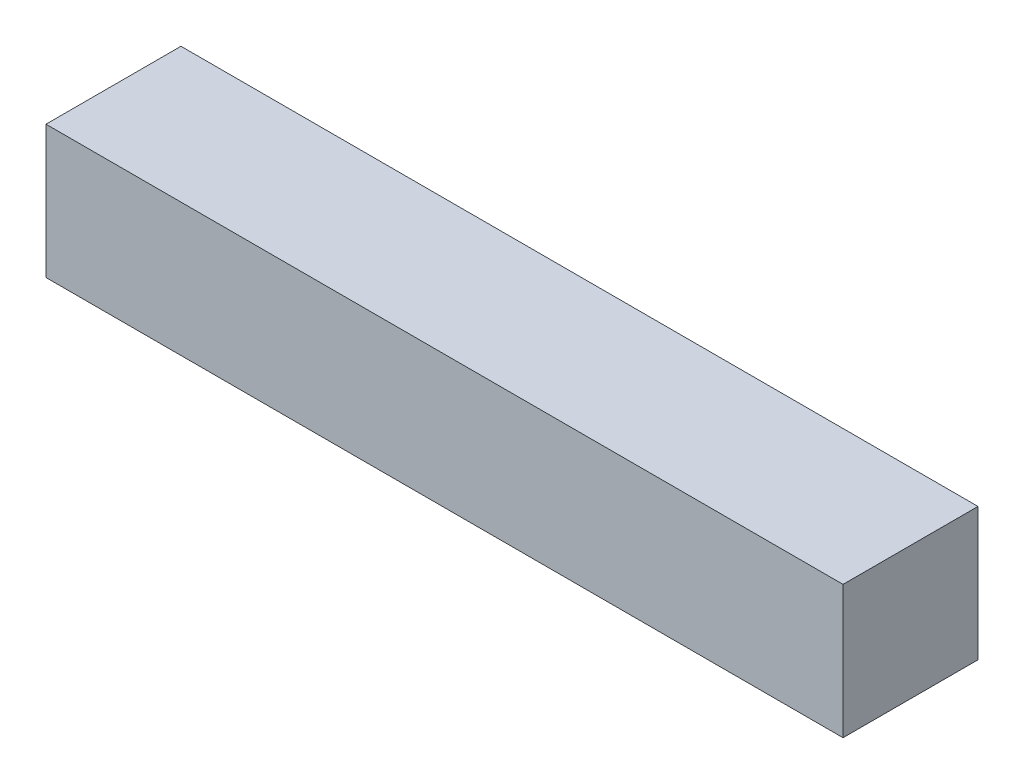
ISO-10303-21;
HEADER;
FILE_DESCRIPTION(('STEP AP214'),'2;1');
FILE_NAME('part.step','',(''),(''),'','','');
FILE_SCHEMA(('AUTOMOTIVE_DESIGN { 1 0 10303 214 1 1 1 1 }'));
ENDSEC;
DATA;
#1=APPLICATION_CONTEXT('core data for automotive mechanical design processes');
#2=APPLICATION_PROTOCOL_DEFINITION('international standard','automotive_design',2000,#1);
#3=PRODUCT_CONTEXT('',#1,'mechanical');
#4=PRODUCT('Part','Part','',(#3));
#5=PRODUCT_RELATED_PRODUCT_CATEGORY('part','',(#4));
#6=PRODUCT_DEFINITION_FORMATION('','',#4);
#7=PRODUCT_DEFINITION_CONTEXT('part definition',#1,'design');
#8=PRODUCT_DEFINITION('design','',#6,#7);
#9=PRODUCT_DEFINITION_SHAPE('','',#8);
#10=(LENGTH_UNIT() NAMED_UNIT(*) SI_UNIT(.MILLI.,.METRE.));
#11=(NAMED_UNIT(*) PLANE_ANGLE_UNIT() SI_UNIT($,.RADIAN.));
#12=(NAMED_UNIT(*) SI_UNIT($,.STERADIAN.) SOLID_ANGLE_UNIT());
#13=UNCERTAINTY_MEASURE_WITH_UNIT(LENGTH_MEASURE(1.E-05),#10,'distance_accuracy_value','');
#14=(GEOMETRIC_REPRESENTATION_CONTEXT(3) GLOBAL_UNCERTAINTY_ASSIGNED_CONTEXT((#13)) GLOBAL_UNIT_ASSIGNED_CONTEXT((#10,
#11,#12)) REPRESENTATION_CONTEXT('',''));
#15=CARTESIAN_POINT('',(0.,0.,0.));
#16=DIRECTION('',(0.,0.,1.));
#17=DIRECTION('',(1.,0.,0.));
#18=AXIS2_PLACEMENT_3D('',#15,#16,#17);
#19=CARTESIAN_POINT('',(75.,25.,-12.7));
#20=DIRECTION('',(-1.,0.,0.));
#21=DIRECTION('',(0.,0.,1.));
#22=AXIS2_PLACEMENT_3D('',#19,#20,#21);
#23=PLANE('',#22);
#24=DIRECTION('',(0.,0.,-1.));
#25=VECTOR('',#24,1.);
#26=CARTESIAN_POINT('',(75.,0.,-12.7));
#27=LINE('',#26,#25);
#28=CARTESIAN_POINT('',(75.,0.,12.7));
#29=VERTEX_POINT('',#28);
#30=CARTESIAN_POINT('',(75.,0.,-12.7));
#31=VERTEX_POINT('',#30);
#32=EDGE_CURVE('E98',#29,#31,#27,.T.);
#33=ORIENTED_EDGE('',*,*,#32,.T.);
#34=DIRECTION('',(0.,-1.,0.));
#35=VECTOR('',#34,1.);
#36=CARTESIAN_POINT('',(75.,25.,-12.7));
#37=LINE('',#36,#35);
#38=CARTESIAN_POINT('',(75.,25.,-12.7));
#39=VERTEX_POINT('',#38);
#40=EDGE_CURVE('E11',#39,#31,#37,.T.);
#41=ORIENTED_EDGE('',*,*,#40,.F.);
#42=DIRECTION('',(0.,0.,-1.));
#43=VECTOR('',#42,1.);
#44=CARTESIAN_POINT('',(75.,25.,-12.7));
#45=LINE('',#44,#43);
#46=CARTESIAN_POINT('',(75.,25.,12.7));
#47=VERTEX_POINT('',#46);
#48=EDGE_CURVE('E86',#47,#39,#45,.T.);
#49=ORIENTED_EDGE('',*,*,#48,.F.);
#50=DIRECTION('',(0.,-1.,0.));
#51=VECTOR('',#50,1.);
#52=CARTESIAN_POINT('',(75.,25.,12.7));
#53=LINE('',#52,#51);
#54=EDGE_CURVE('E94',#47,#29,#53,.T.);
#55=ORIENTED_EDGE('',*,*,#54,.T.);
#56=EDGE_LOOP('',(#33,#41,#49,#55));
#57=FACE_BOUND('',#56,.T.);
#58=ADVANCED_FACE('F35',(#57),#23,.F.);
#59=CARTESIAN_POINT('',(-75.,25.,-12.7));
#60=DIRECTION('',(0.,0.,1.));
#61=DIRECTION('',(1.,0.,0.));
#62=AXIS2_PLACEMENT_3D('',#59,#60,#61);
#63=PLANE('',#62);
#64=DIRECTION('',(-1.,0.,0.));
#65=VECTOR('',#64,1.);
#66=CARTESIAN_POINT('',(-75.,0.,-12.7));
#67=LINE('',#66,#65);
#68=CARTESIAN_POINT('',(-75.,0.,-12.7));
#69=VERTEX_POINT('',#68);
#70=EDGE_CURVE('E90',#31,#69,#67,.T.);
#71=ORIENTED_EDGE('',*,*,#70,.T.);
#72=DIRECTION('',(0.,-1.,0.));
#73=VECTOR('',#72,1.);
#74=CARTESIAN_POINT('',(-75.,25.,-12.7));
#75=LINE('',#74,#73);
#76=CARTESIAN_POINT('',(-75.,25.,-12.7));
#77=VERTEX_POINT('',#76);
#78=EDGE_CURVE('E43',#77,#69,#75,.T.);
#79=ORIENTED_EDGE('',*,*,#78,.F.);
#80=DIRECTION('',(-1.,0.,0.));
#81=VECTOR('',#80,1.);
#82=CARTESIAN_POINT('',(-75.,25.,-12.7));
#83=LINE('',#82,#81);
#84=EDGE_CURVE('E81',#39,#77,#83,.T.);
#85=ORIENTED_EDGE('',*,*,#84,.F.);
#86=ORIENTED_EDGE('',*,*,#40,.T.);
#87=EDGE_LOOP('',(#71,#79,#85,#86));
#88=FACE_BOUND('',#87,.T.);
#89=ADVANCED_FACE('F89',(#88),#63,.F.);
#90=CARTESIAN_POINT('',(-75.,25.,-12.7));
#91=DIRECTION('',(1.,0.,0.));
#92=DIRECTION('',(0.,0.,-1.));
#93=AXIS2_PLACEMENT_3D('',#90,#91,#92);
#94=PLANE('',#93);
#95=DIRECTION('',(0.,0.,1.));
#96=VECTOR('',#95,1.);
#97=CARTESIAN_POINT('',(-75.,0.,-12.7));
#98=LINE('',#97,#96);
#99=CARTESIAN_POINT('',(-75.,0.,12.7));
#100=VERTEX_POINT('',#99);
#101=EDGE_CURVE('E68',#69,#100,#98,.T.);
#102=ORIENTED_EDGE('',*,*,#101,.T.);
#103=DIRECTION('',(0.,-1.,0.));
#104=VECTOR('',#103,1.);
#105=CARTESIAN_POINT('',(-75.,25.,12.7));
#106=LINE('',#105,#104);
#107=CARTESIAN_POINT('',(-75.,25.,12.7));
#108=VERTEX_POINT('',#107);
#109=EDGE_CURVE('E91',#108,#100,#106,.T.);
#110=ORIENTED_EDGE('',*,*,#109,.F.);
#111=DIRECTION('',(0.,0.,1.));
#112=VECTOR('',#111,1.);
#113=CARTESIAN_POINT('',(-75.,25.,-12.7));
#114=LINE('',#113,#112);
#115=EDGE_CURVE('E84',#77,#108,#114,.T.);
#116=ORIENTED_EDGE('',*,*,#115,.F.);
#117=ORIENTED_EDGE('',*,*,#78,.T.);
#118=EDGE_LOOP('',(#102,#110,#116,#117));
#119=FACE_BOUND('',#118,.T.);
#120=ADVANCED_FACE('F92',(#119),#94,.F.);
#121=CARTESIAN_POINT('',(-75.,25.,12.7));
#122=DIRECTION('',(0.,0.,-1.));
#123=DIRECTION('',(-1.,0.,0.));
#124=AXIS2_PLACEMENT_3D('',#121,#122,#123);
#125=PLANE('',#124);
#126=DIRECTION('',(1.,0.,0.));
#127=VECTOR('',#126,1.);
#128=CARTESIAN_POINT('',(-75.,0.,12.7));
#129=LINE('',#128,#127);
#130=EDGE_CURVE('E74',#100,#29,#129,.T.);
#131=ORIENTED_EDGE('',*,*,#130,.T.);
#132=ORIENTED_EDGE('',*,*,#54,.F.);
#133=DIRECTION('',(1.,0.,0.));
#134=VECTOR('',#133,1.);
#135=CARTESIAN_POINT('',(-75.,25.,12.7));
#136=LINE('',#135,#134);
#137=EDGE_CURVE('E51',#108,#47,#136,.T.);
#138=ORIENTED_EDGE('',*,*,#137,.F.);
#139=ORIENTED_EDGE('',*,*,#109,.T.);
#140=EDGE_LOOP('',(#131,#132,#138,#139));
#141=FACE_BOUND('',#140,.T.);
#142=ADVANCED_FACE('F105',(#141),#125,.F.);
#143=CARTESIAN_POINT('',(0.,25.,0.));
#144=DIRECTION('',(0.,1.,0.));
#145=DIRECTION('',(0.,0.,1.));
#146=AXIS2_PLACEMENT_3D('',#143,#144,#145);
#147=PLANE('',#146);
#148=ORIENTED_EDGE('',*,*,#48,.T.);
#149=ORIENTED_EDGE('',*,*,#84,.T.);
#150=ORIENTED_EDGE('',*,*,#115,.T.);
#151=ORIENTED_EDGE('',*,*,#137,.T.);
#152=EDGE_LOOP('',(#148,#149,#150,#151));
#153=FACE_BOUND('',#152,.T.);
#154=ADVANCED_FACE('F82',(#153),#147,.T.);
#155=CARTESIAN_POINT('',(0.,0.,0.));
#156=DIRECTION('',(0.,1.,0.));
#157=DIRECTION('',(0.,0.,1.));
#158=AXIS2_PLACEMENT_3D('',#155,#156,#157);
#159=PLANE('',#158);
#160=ORIENTED_EDGE('',*,*,#32,.F.);
#161=ORIENTED_EDGE('',*,*,#130,.F.);
#162=ORIENTED_EDGE('',*,*,#101,.F.);
#163=ORIENTED_EDGE('',*,*,#70,.F.);
#164=EDGE_LOOP('',(#160,#161,#162,#163));
#165=FACE_BOUND('',#164,.T.);
#166=ADVANCED_FACE('F108',(#165),#159,.F.);
#167=CLOSED_SHELL('',(#58,#89,#120,#142,#154,#166));
#168=MANIFOLD_SOLID_BREP('B2',#167);
#169=ADVANCED_BREP_SHAPE_REPRESENTATION('',(#18,#168),#14);
#170=SHAPE_DEFINITION_REPRESENTATION(#9,#169);
ENDSEC;
END-ISO-10303-21;
